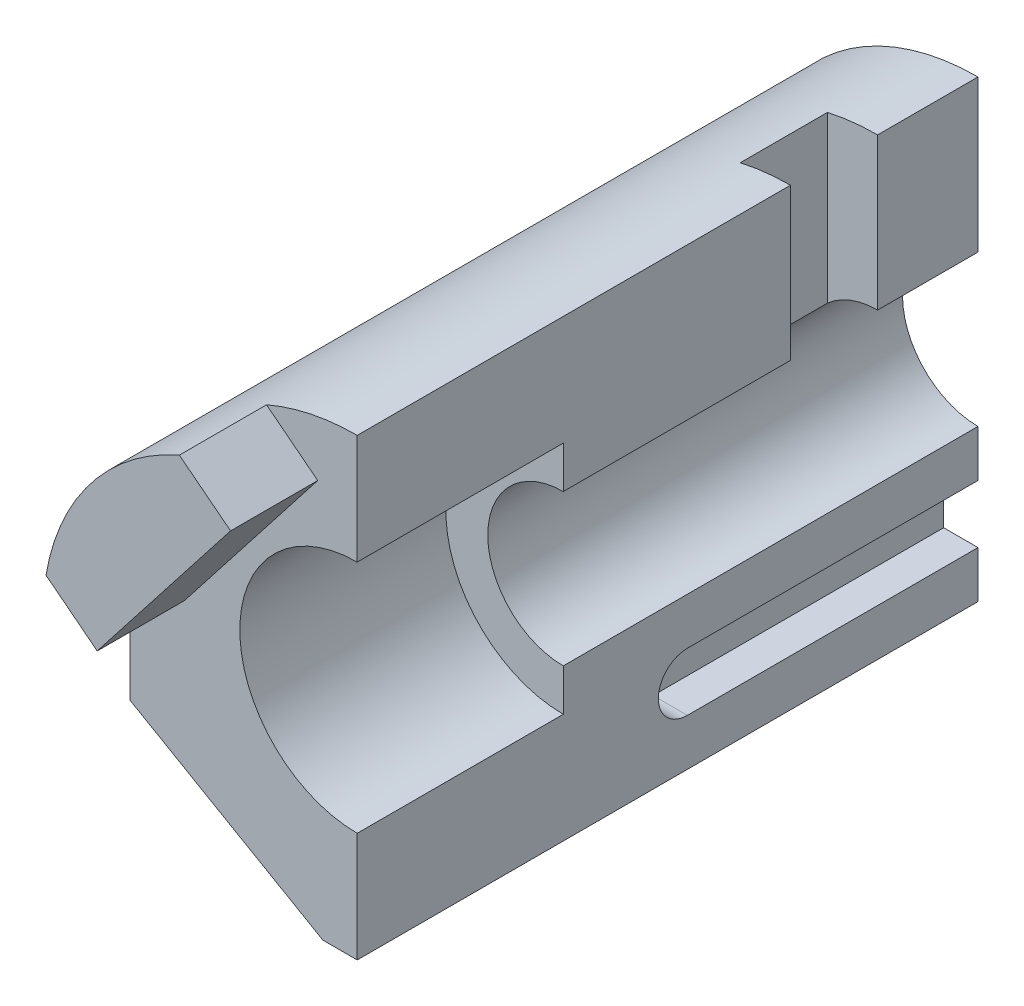
ISO-10303-21;
HEADER;
FILE_DESCRIPTION(('STEP AP214'),'2;1');
FILE_NAME('part.step','',(''),(''),'','','');
FILE_SCHEMA(('AUTOMOTIVE_DESIGN { 1 0 10303 214 1 1 1 1 }'));
ENDSEC;
DATA;
#1=APPLICATION_CONTEXT('core data for automotive mechanical design processes');
#2=APPLICATION_PROTOCOL_DEFINITION('international standard','automotive_design',2000,#1);
#3=PRODUCT_CONTEXT('',#1,'mechanical');
#4=PRODUCT('Part','Part','',(#3));
#5=PRODUCT_RELATED_PRODUCT_CATEGORY('part','',(#4));
#6=PRODUCT_DEFINITION_FORMATION('','',#4);
#7=PRODUCT_DEFINITION_CONTEXT('part definition',#1,'design');
#8=PRODUCT_DEFINITION('design','',#6,#7);
#9=PRODUCT_DEFINITION_SHAPE('','',#8);
#10=(LENGTH_UNIT() NAMED_UNIT(*) SI_UNIT(.MILLI.,.METRE.));
#11=(NAMED_UNIT(*) PLANE_ANGLE_UNIT() SI_UNIT($,.RADIAN.));
#12=(NAMED_UNIT(*) SI_UNIT($,.STERADIAN.) SOLID_ANGLE_UNIT());
#13=UNCERTAINTY_MEASURE_WITH_UNIT(LENGTH_MEASURE(1.E-05),#10,'distance_accuracy_value','');
#14=(GEOMETRIC_REPRESENTATION_CONTEXT(3) GLOBAL_UNCERTAINTY_ASSIGNED_CONTEXT((#13)) GLOBAL_UNIT_ASSIGNED_CONTEXT((#10,
#11,#12)) REPRESENTATION_CONTEXT('',''));
#15=CARTESIAN_POINT('',(0.,0.,0.));
#16=DIRECTION('',(0.,0.,1.));
#17=DIRECTION('',(1.,0.,0.));
#18=AXIS2_PLACEMENT_3D('',#15,#16,#17);
#19=CARTESIAN_POINT('',(0.,172.,235.));
#20=DIRECTION('',(-1.,0.,0.));
#21=DIRECTION('',(0.,-1.,0.));
#22=AXIS2_PLACEMENT_3D('',#19,#20,#21);
#23=PLANE('',#22);
#24=DIRECTION('',(0.,1.,0.));
#25=VECTOR('',#24,1.);
#26=CARTESIAN_POINT('',(0.,172.,38.));
#27=LINE('',#26,#25);
#28=CARTESIAN_POINT('',(0.,114.575,38.));
#29=VERTEX_POINT('',#28);
#30=CARTESIAN_POINT('',(0.,172.,38.));
#31=VERTEX_POINT('',#30);
#32=EDGE_CURVE('E198',#29,#31,#27,.T.);
#33=ORIENTED_EDGE('',*,*,#32,.F.);
#34=DIRECTION('',(0.,0.,1.));
#35=VECTOR('',#34,1.);
#36=CARTESIAN_POINT('',(0.,114.575,-33.0000000000001));
#37=LINE('',#36,#35);
#38=CARTESIAN_POINT('',(0.,114.575,0.));
#39=VERTEX_POINT('',#38);
#40=EDGE_CURVE('E293',#29,#39,#37,.F.);
#41=ORIENTED_EDGE('',*,*,#40,.T.);
#42=DIRECTION('',(0.,1.,0.));
#43=VECTOR('',#42,1.);
#44=CARTESIAN_POINT('',(0.,172.,0.));
#45=LINE('',#44,#43);
#46=CARTESIAN_POINT('',(0.,172.,0.));
#47=VERTEX_POINT('',#46);
#48=EDGE_CURVE('E316',#39,#47,#45,.T.);
#49=ORIENTED_EDGE('',*,*,#48,.T.);
#50=DIRECTION('',(0.,0.,-1.));
#51=VECTOR('',#50,1.);
#52=CARTESIAN_POINT('',(0.,172.,235.));
#53=LINE('',#52,#51);
#54=EDGE_CURVE('E369',#31,#47,#53,.T.);
#55=ORIENTED_EDGE('',*,*,#54,.F.);
#56=EDGE_LOOP('',(#33,#41,#49,#55));
#57=FACE_BOUND('',#56,.T.);
#58=ADVANCED_FACE('F45',(#57),#23,.F.);
#59=CARTESIAN_POINT('',(0.,0.,0.));
#60=VERTEX_POINT('',#59);
#61=CARTESIAN_POINT('',(0.,17.7125,0.));
#62=VERTEX_POINT('',#61);
#63=EDGE_CURVE('E337',#60,#62,#45,.T.);
#64=ORIENTED_EDGE('',*,*,#63,.T.);
#65=DIRECTION('',(0.,0.,-1.));
#66=VECTOR('',#65,1.);
#67=CARTESIAN_POINT('',(0.,17.7125,0.));
#68=LINE('',#67,#66);
#69=CARTESIAN_POINT('',(0.,17.7125,110.));
#70=VERTEX_POINT('',#69);
#71=EDGE_CURVE('E257',#70,#62,#68,.T.);
#72=ORIENTED_EDGE('',*,*,#71,.F.);
#73=CARTESIAN_POINT('',(0.,28.7125,110.));
#74=DIRECTION('',(1.,0.,0.));
#75=DIRECTION('',(0.,1.,0.));
#76=AXIS2_PLACEMENT_3D('',#73,#74,#75);
#77=CIRCLE('',#76,11.);
#78=CARTESIAN_POINT('',(0.,39.7125,110.));
#79=VERTEX_POINT('',#78);
#80=EDGE_CURVE('E268',#79,#70,#77,.T.);
#81=ORIENTED_EDGE('',*,*,#80,.F.);
#82=DIRECTION('',(0.,0.,1.));
#83=VECTOR('',#82,1.);
#84=CARTESIAN_POINT('',(0.,39.7125,0.));
#85=LINE('',#84,#83);
#86=CARTESIAN_POINT('',(0.,39.7125,0.));
#87=VERTEX_POINT('',#86);
#88=EDGE_CURVE('E251',#87,#79,#85,.T.);
#89=ORIENTED_EDGE('',*,*,#88,.F.);
#90=CARTESIAN_POINT('',(0.,57.425,0.));
#91=VERTEX_POINT('',#90);
#92=EDGE_CURVE('E342',#87,#91,#45,.T.);
#93=ORIENTED_EDGE('',*,*,#92,.T.);
#94=DIRECTION('',(0.,0.,1.));
#95=VECTOR('',#94,1.);
#96=CARTESIAN_POINT('',(0.,57.425,-33.0000000000001));
#97=LINE('',#96,#95);
#98=CARTESIAN_POINT('',(0.,57.425,157.));
#99=VERTEX_POINT('',#98);
#100=EDGE_CURVE('E297',#91,#99,#97,.T.);
#101=ORIENTED_EDGE('',*,*,#100,.T.);
#102=DIRECTION('',(0.,1.,0.));
#103=VECTOR('',#102,1.);
#104=CARTESIAN_POINT('',(0.,172.,157.));
#105=LINE('',#104,#103);
#106=CARTESIAN_POINT('',(0.,41.55,157.));
#107=VERTEX_POINT('',#106);
#108=EDGE_CURVE('E375',#107,#99,#105,.T.);
#109=ORIENTED_EDGE('',*,*,#108,.F.);
#110=DIRECTION('',(0.,0.,1.));
#111=VECTOR('',#110,1.);
#112=CARTESIAN_POINT('',(0.,41.55,157.));
#113=LINE('',#112,#111);
#114=CARTESIAN_POINT('',(0.,41.55,235.));
#115=VERTEX_POINT('',#114);
#116=EDGE_CURVE('E312',#107,#115,#113,.T.);
#117=ORIENTED_EDGE('',*,*,#116,.T.);
#118=DIRECTION('',(0.,1.,0.));
#119=VECTOR('',#118,1.);
#120=CARTESIAN_POINT('',(0.,172.,235.));
#121=LINE('',#120,#119);
#122=CARTESIAN_POINT('',(0.,0.,235.));
#123=VERTEX_POINT('',#122);
#124=EDGE_CURVE('E317',#123,#115,#121,.T.);
#125=ORIENTED_EDGE('',*,*,#124,.F.);
#126=DIRECTION('',(0.,0.,-1.));
#127=VECTOR('',#126,1.);
#128=CARTESIAN_POINT('',(0.,0.,235.));
#129=LINE('',#128,#127);
#130=EDGE_CURVE('E336',#123,#60,#129,.T.);
#131=ORIENTED_EDGE('',*,*,#130,.T.);
#132=EDGE_LOOP('',(#64,#72,#81,#89,#93,#101,#109,#117,#125,#131));
#133=FACE_BOUND('',#132,.T.);
#134=ADVANCED_FACE('F453',(#133),#23,.F.);
#135=CARTESIAN_POINT('',(0.,114.575,157.));
#136=VERTEX_POINT('',#135);
#137=CARTESIAN_POINT('',(0.,114.575,71.));
#138=VERTEX_POINT('',#137);
#139=EDGE_CURVE('E294',#136,#138,#37,.F.);
#140=ORIENTED_EDGE('',*,*,#139,.T.);
#141=DIRECTION('',(0.,-1.,0.));
#142=VECTOR('',#141,1.);
#143=CARTESIAN_POINT('',(0.,172.,71.));
#144=LINE('',#143,#142);
#145=CARTESIAN_POINT('',(0.,172.,71.));
#146=VERTEX_POINT('',#145);
#147=EDGE_CURVE('E204',#146,#138,#144,.T.);
#148=ORIENTED_EDGE('',*,*,#147,.F.);
#149=CARTESIAN_POINT('',(0.,172.,235.));
#150=VERTEX_POINT('',#149);
#151=EDGE_CURVE('E370',#150,#146,#53,.T.);
#152=ORIENTED_EDGE('',*,*,#151,.F.);
#153=CARTESIAN_POINT('',(0.,130.45,235.));
#154=VERTEX_POINT('',#153);
#155=EDGE_CURVE('E322',#154,#150,#121,.T.);
#156=ORIENTED_EDGE('',*,*,#155,.F.);
#157=DIRECTION('',(0.,0.,1.));
#158=VECTOR('',#157,1.);
#159=CARTESIAN_POINT('',(0.,130.45,157.));
#160=LINE('',#159,#158);
#161=CARTESIAN_POINT('',(0.,130.45,157.));
#162=VERTEX_POINT('',#161);
#163=EDGE_CURVE('E306',#154,#162,#160,.F.);
#164=ORIENTED_EDGE('',*,*,#163,.T.);
#165=EDGE_CURVE('E374',#136,#162,#105,.T.);
#166=ORIENTED_EDGE('',*,*,#165,.F.);
#167=EDGE_LOOP('',(#140,#148,#152,#156,#164,#166));
#168=FACE_BOUND('',#167,.T.);
#169=ADVANCED_FACE('F47',(#168),#23,.F.);
#170=CARTESIAN_POINT('',(-5.01709784828108E-09,86.,235.));
#171=DIRECTION('',(0.,0.,-1.));
#172=DIRECTION('',(-1.,0.,0.));
#173=AXIS2_PLACEMENT_3D('',#170,#171,#172);
#174=CYLINDRICAL_SURFACE('',#173,86.);
#175=ORIENTED_EDGE('',*,*,#151,.T.);
#176=CARTESIAN_POINT('',(-5.01709784828108E-09,86.,71.));
#177=DIRECTION('',(0.,0.,1.));
#178=DIRECTION('',(1.,0.,0.));
#179=AXIS2_PLACEMENT_3D('',#176,#177,#178);
#180=CIRCLE('',#179,86.);
#181=CARTESIAN_POINT('',(-19.,169.874906856524,71.));
#182=VERTEX_POINT('',#181);
#183=EDGE_CURVE('E11',#146,#182,#180,.T.);
#184=ORIENTED_EDGE('',*,*,#183,.T.);
#185=DIRECTION('',(0.,0.,-1.));
#186=VECTOR('',#185,1.);
#187=CARTESIAN_POINT('',(-19.,169.874906856524,235.));
#188=LINE('',#187,#186);
#189=CARTESIAN_POINT('',(-19.,169.874906856524,38.));
#190=VERTEX_POINT('',#189);
#191=EDGE_CURVE('E195',#190,#182,#188,.F.);
#192=ORIENTED_EDGE('',*,*,#191,.F.);
#193=CARTESIAN_POINT('',(-5.01709784828108E-09,86.,38.));
#194=DIRECTION('',(0.,0.,-1.));
#195=DIRECTION('',(0.,1.,0.));
#196=AXIS2_PLACEMENT_3D('',#193,#194,#195);
#197=CIRCLE('',#196,86.);
#198=EDGE_CURVE('E54',#190,#31,#197,.T.);
#199=ORIENTED_EDGE('',*,*,#198,.T.);
#200=ORIENTED_EDGE('',*,*,#54,.T.);
#201=CARTESIAN_POINT('',(-5.01709784828108E-09,86.,0.));
#202=DIRECTION('',(0.,0.,1.));
#203=DIRECTION('',(-1.,0.,0.));
#204=AXIS2_PLACEMENT_3D('',#201,#202,#203);
#205=CIRCLE('',#204,86.);
#206=CARTESIAN_POINT('',(-86.,85.9990710556561,0.));
#207=VERTEX_POINT('',#206);
#208=EDGE_CURVE('E341',#47,#207,#205,.T.);
#209=ORIENTED_EDGE('',*,*,#208,.T.);
#210=DIRECTION('',(0.,0.,-1.));
#211=VECTOR('',#210,1.);
#212=CARTESIAN_POINT('',(-86.,85.9990710556561,235.));
#213=LINE('',#212,#211);
#214=CARTESIAN_POINT('',(-86.,85.9990710556561,235.));
#215=VERTEX_POINT('',#214);
#216=EDGE_CURVE('E365',#215,#207,#213,.T.);
#217=ORIENTED_EDGE('',*,*,#216,.F.);
#218=CARTESIAN_POINT('',(-5.01709784828108E-09,86.,235.));
#219=DIRECTION('',(0.,0.,1.));
#220=DIRECTION('',(-1.,0.,0.));
#221=AXIS2_PLACEMENT_3D('',#218,#219,#220);
#222=CIRCLE('',#221,86.);
#223=CARTESIAN_POINT('',(-84.8138572204116,100.234100753004,235.));
#224=VERTEX_POINT('',#223);
#225=EDGE_CURVE('E321',#224,#215,#222,.T.);
#226=ORIENTED_EDGE('',*,*,#225,.F.);
#227=DIRECTION('',(0.,0.,-1.));
#228=VECTOR('',#227,1.);
#229=CARTESIAN_POINT('',(-84.8138572204116,100.234100753004,268.));
#230=LINE('',#229,#228);
#231=CARTESIAN_POINT('',(-84.8138572204116,100.234100753004,268.));
#232=VERTEX_POINT('',#231);
#233=EDGE_CURVE('E248',#232,#224,#230,.T.);
#234=ORIENTED_EDGE('',*,*,#233,.F.);
#235=CARTESIAN_POINT('',(-5.01709784828108E-09,86.,268.));
#236=DIRECTION('',(0.,0.,1.));
#237=DIRECTION('',(1.,0.,0.));
#238=AXIS2_PLACEMENT_3D('',#235,#236,#237);
#239=CIRCLE('',#238,86.);
#240=CARTESIAN_POINT('',(-34.329616243708,164.850982548756,268.));
#241=VERTEX_POINT('',#240);
#242=EDGE_CURVE('E220',#241,#232,#239,.T.);
#243=ORIENTED_EDGE('',*,*,#242,.F.);
#244=DIRECTION('',(0.,0.,-1.));
#245=VECTOR('',#244,1.);
#246=CARTESIAN_POINT('',(-34.329616243708,164.850982548756,268.));
#247=LINE('',#246,#245);
#248=CARTESIAN_POINT('',(-34.329616243708,164.850982548756,235.));
#249=VERTEX_POINT('',#248);
#250=EDGE_CURVE('E238',#241,#249,#247,.T.);
#251=ORIENTED_EDGE('',*,*,#250,.T.);
#252=EDGE_CURVE('E323',#150,#249,#222,.T.);
#253=ORIENTED_EDGE('',*,*,#252,.F.);
#254=EDGE_LOOP('',(#175,#184,#192,#199,#200,#209,#217,#226,#234,#243,#251,#253));
#255=FACE_BOUND('',#254,.T.);
#256=ADVANCED_FACE('F400',(#255),#174,.T.);
#257=CARTESIAN_POINT('',(-86.,42.1465696508428,235.));
#258=DIRECTION('',(1.,0.,0.));
#259=DIRECTION('',(0.,0.,-1.));
#260=AXIS2_PLACEMENT_3D('',#257,#258,#259);
#261=PLANE('',#260);
#262=DIRECTION('',(0.,-1.,0.));
#263=VECTOR('',#262,1.);
#264=CARTESIAN_POINT('',(-86.,42.1465696508428,0.));
#265=LINE('',#264,#263);
#266=CARTESIAN_POINT('',(-86.,42.1465696508428,0.));
#267=VERTEX_POINT('',#266);
#268=EDGE_CURVE('E345',#207,#267,#265,.T.);
#269=ORIENTED_EDGE('',*,*,#268,.T.);
#270=DIRECTION('',(0.,0.,-1.));
#271=VECTOR('',#270,1.);
#272=CARTESIAN_POINT('',(-86.,42.1465696508428,235.));
#273=LINE('',#272,#271);
#274=CARTESIAN_POINT('',(-86.,42.1465696508428,235.));
#275=VERTEX_POINT('',#274);
#276=EDGE_CURVE('E361',#275,#267,#273,.T.);
#277=ORIENTED_EDGE('',*,*,#276,.F.);
#278=DIRECTION('',(0.,-1.,0.));
#279=VECTOR('',#278,1.);
#280=CARTESIAN_POINT('',(-86.,42.1465696508428,235.));
#281=LINE('',#280,#279);
#282=EDGE_CURVE('E327',#215,#275,#281,.T.);
#283=ORIENTED_EDGE('',*,*,#282,.F.);
#284=ORIENTED_EDGE('',*,*,#216,.T.);
#285=EDGE_LOOP('',(#269,#277,#283,#284));
#286=FACE_BOUND('',#285,.T.);
#287=ADVANCED_FACE('F424',(#286),#261,.F.);
#288=CARTESIAN_POINT('',(-13.,0.,235.));
#289=DIRECTION('',(0.500000000000001,0.866025403784438,0.));
#290=DIRECTION('',(-0.866025403784438,0.500000000000001,0.));
#291=AXIS2_PLACEMENT_3D('',#288,#289,#290);
#292=PLANE('',#291);
#293=DIRECTION('',(0.866025403784438,-0.500000000000001,0.));
#294=VECTOR('',#293,1.);
#295=CARTESIAN_POINT('',(-13.,0.,0.));
#296=LINE('',#295,#294);
#297=CARTESIAN_POINT('',(-13.,0.,0.));
#298=VERTEX_POINT('',#297);
#299=EDGE_CURVE('E348',#267,#298,#296,.T.);
#300=ORIENTED_EDGE('',*,*,#299,.T.);
#301=DIRECTION('',(0.,0.,-1.));
#302=VECTOR('',#301,1.);
#303=CARTESIAN_POINT('',(-13.,0.,235.));
#304=LINE('',#303,#302);
#305=CARTESIAN_POINT('',(-13.,0.,235.));
#306=VERTEX_POINT('',#305);
#307=EDGE_CURVE('E357',#306,#298,#304,.T.);
#308=ORIENTED_EDGE('',*,*,#307,.F.);
#309=DIRECTION('',(0.866025403784438,-0.500000000000001,0.));
#310=VECTOR('',#309,1.);
#311=CARTESIAN_POINT('',(-13.,0.,235.));
#312=LINE('',#311,#310);
#313=EDGE_CURVE('E330',#275,#306,#312,.T.);
#314=ORIENTED_EDGE('',*,*,#313,.F.);
#315=ORIENTED_EDGE('',*,*,#276,.T.);
#316=EDGE_LOOP('',(#300,#308,#314,#315));
#317=FACE_BOUND('',#316,.T.);
#318=ADVANCED_FACE('F476',(#317),#292,.F.);
#319=CARTESIAN_POINT('',(0.,0.,235.));
#320=DIRECTION('',(0.,1.,0.));
#321=DIRECTION('',(-1.,0.,0.));
#322=AXIS2_PLACEMENT_3D('',#319,#320,#321);
#323=PLANE('',#322);
#324=DIRECTION('',(1.,0.,0.));
#325=VECTOR('',#324,1.);
#326=CARTESIAN_POINT('',(0.,0.,0.));
#327=LINE('',#326,#325);
#328=EDGE_CURVE('E351',#298,#60,#327,.T.);
#329=ORIENTED_EDGE('',*,*,#328,.T.);
#330=ORIENTED_EDGE('',*,*,#130,.F.);
#331=DIRECTION('',(1.,0.,0.));
#332=VECTOR('',#331,1.);
#333=CARTESIAN_POINT('',(0.,0.,235.));
#334=LINE('',#333,#332);
#335=EDGE_CURVE('E333',#306,#123,#334,.T.);
#336=ORIENTED_EDGE('',*,*,#335,.F.);
#337=ORIENTED_EDGE('',*,*,#307,.T.);
#338=EDGE_LOOP('',(#329,#330,#336,#337));
#339=FACE_BOUND('',#338,.T.);
#340=ADVANCED_FACE('F474',(#339),#323,.F.);
#341=CARTESIAN_POINT('',(-5.01709784828108E-09,86.,235.));
#342=DIRECTION('',(0.,0.,-1.));
#343=DIRECTION('',(-1.,0.,0.));
#344=AXIS2_PLACEMENT_3D('',#341,#342,#343);
#345=PLANE('',#344);
#346=DIRECTION('',(-0.615661475325653,-0.788010753606726,0.));
#347=VECTOR('',#346,1.);
#348=CARTESIAN_POINT('',(-40.1885484389601,117.398735241608,235.));
#349=LINE('',#348,#347);
#350=CARTESIAN_POINT('',(-14.9464279506083,149.707176139484,235.));
#351=VERTEX_POINT('',#350);
#352=CARTESIAN_POINT('',(-65.4306689273119,85.0902943437325,235.));
#353=VERTEX_POINT('',#352);
#354=EDGE_CURVE('E387',#351,#353,#349,.T.);
#355=ORIENTED_EDGE('',*,*,#354,.T.);
#356=DIRECTION('',(-0.788010753606726,0.615661475325653,0.));
#357=VECTOR('',#356,1.);
#358=CARTESIAN_POINT('',(-25.2421204933689,53.6915591021242,235.));
#359=LINE('',#358,#357);
#360=EDGE_CURVE('E391',#353,#224,#359,.T.);
#361=ORIENTED_EDGE('',*,*,#360,.T.);
#362=ORIENTED_EDGE('',*,*,#225,.T.);
#363=ORIENTED_EDGE('',*,*,#282,.T.);
#364=ORIENTED_EDGE('',*,*,#313,.T.);
#365=ORIENTED_EDGE('',*,*,#335,.T.);
#366=ORIENTED_EDGE('',*,*,#124,.T.);
#367=CARTESIAN_POINT('',(0.,86.,235.));
#368=DIRECTION('',(0.,0.,1.));
#369=DIRECTION('',(1.,0.,0.));
#370=AXIS2_PLACEMENT_3D('',#367,#368,#369);
#371=CIRCLE('',#370,44.45);
#372=EDGE_CURVE('E301',#154,#115,#371,.T.);
#373=ORIENTED_EDGE('',*,*,#372,.F.);
#374=ORIENTED_EDGE('',*,*,#155,.T.);
#375=ORIENTED_EDGE('',*,*,#252,.T.);
#376=DIRECTION('',(0.788010753606726,-0.615661475325654,0.));
#377=VECTOR('',#376,1.);
#378=CARTESIAN_POINT('',(25.2421204833347,118.308440897876,235.));
#379=LINE('',#378,#377);
#380=EDGE_CURVE('E383',#249,#351,#379,.T.);
#381=ORIENTED_EDGE('',*,*,#380,.T.);
#382=EDGE_LOOP('',(#355,#361,#362,#363,#364,#365,#366,#373,#374,#375,#381));
#383=FACE_BOUND('',#382,.T.);
#384=ADVANCED_FACE('F428',(#383),#345,.F.);
#385=CARTESIAN_POINT('',(-5.01709784828108E-09,86.,0.));
#386=DIRECTION('',(0.,0.,-1.));
#387=DIRECTION('',(-1.,0.,0.));
#388=AXIS2_PLACEMENT_3D('',#385,#386,#387);
#389=PLANE('',#388);
#390=DIRECTION('',(1.,0.,0.));
#391=VECTOR('',#390,1.);
#392=CARTESIAN_POINT('',(-13.,17.7125,0.));
#393=LINE('',#392,#391);
#394=CARTESIAN_POINT('',(-13.,17.7125,0.));
#395=VERTEX_POINT('',#394);
#396=EDGE_CURVE('E274',#395,#62,#393,.T.);
#397=ORIENTED_EDGE('',*,*,#396,.T.);
#398=ORIENTED_EDGE('',*,*,#63,.F.);
#399=ORIENTED_EDGE('',*,*,#328,.F.);
#400=ORIENTED_EDGE('',*,*,#299,.F.);
#401=ORIENTED_EDGE('',*,*,#268,.F.);
#402=ORIENTED_EDGE('',*,*,#208,.F.);
#403=ORIENTED_EDGE('',*,*,#48,.F.);
#404=CARTESIAN_POINT('',(0.,86.,0.));
#405=DIRECTION('',(0.,0.,-1.));
#406=DIRECTION('',(-1.,0.,0.));
#407=AXIS2_PLACEMENT_3D('',#404,#405,#406);
#408=CIRCLE('',#407,28.575);
#409=EDGE_CURVE('E289',#91,#39,#408,.T.);
#410=ORIENTED_EDGE('',*,*,#409,.F.);
#411=ORIENTED_EDGE('',*,*,#92,.F.);
#412=DIRECTION('',(1.,0.,0.));
#413=VECTOR('',#412,1.);
#414=CARTESIAN_POINT('',(-13.,39.7125,0.));
#415=LINE('',#414,#413);
#416=CARTESIAN_POINT('',(-13.,39.7125,0.));
#417=VERTEX_POINT('',#416);
#418=EDGE_CURVE('E264',#417,#87,#415,.T.);
#419=ORIENTED_EDGE('',*,*,#418,.F.);
#420=DIRECTION('',(0.,-1.,0.));
#421=VECTOR('',#420,1.);
#422=CARTESIAN_POINT('',(-13.,86.,0.));
#423=LINE('',#422,#421);
#424=EDGE_CURVE('E379',#417,#395,#423,.T.);
#425=ORIENTED_EDGE('',*,*,#424,.T.);
#426=EDGE_LOOP('',(#397,#398,#399,#400,#401,#402,#403,#410,#411,#419,#425));
#427=FACE_BOUND('',#426,.T.);
#428=ADVANCED_FACE('F417',(#427),#389,.T.);
#429=CARTESIAN_POINT('',(0.,86.,157.));
#430=DIRECTION('',(0.,0.,1.));
#431=DIRECTION('',(1.,0.,0.));
#432=AXIS2_PLACEMENT_3D('',#429,#430,#431);
#433=PLANE('',#432);
#434=CARTESIAN_POINT('',(0.,86.,157.));
#435=DIRECTION('',(0.,0.,1.));
#436=DIRECTION('',(1.,0.,0.));
#437=AXIS2_PLACEMENT_3D('',#434,#435,#436);
#438=CIRCLE('',#437,28.575);
#439=EDGE_CURVE('E278',#136,#99,#438,.T.);
#440=ORIENTED_EDGE('',*,*,#439,.F.);
#441=ORIENTED_EDGE('',*,*,#165,.T.);
#442=CARTESIAN_POINT('',(0.,86.,157.));
#443=DIRECTION('',(0.,0.,1.));
#444=DIRECTION('',(1.,0.,0.));
#445=AXIS2_PLACEMENT_3D('',#442,#443,#444);
#446=CIRCLE('',#445,44.45);
#447=EDGE_CURVE('E302',#162,#107,#446,.T.);
#448=ORIENTED_EDGE('',*,*,#447,.T.);
#449=ORIENTED_EDGE('',*,*,#108,.T.);
#450=EDGE_LOOP('',(#440,#441,#448,#449));
#451=FACE_BOUND('',#450,.T.);
#452=ADVANCED_FACE('F449',(#451),#433,.T.);
#453=CARTESIAN_POINT('',(0.,86.,157.));
#454=DIRECTION('',(0.,0.,1.));
#455=DIRECTION('',(1.,0.,0.));
#456=AXIS2_PLACEMENT_3D('',#453,#454,#455);
#457=CYLINDRICAL_SURFACE('',#456,44.45);
#458=ORIENTED_EDGE('',*,*,#447,.F.);
#459=ORIENTED_EDGE('',*,*,#163,.F.);
#460=ORIENTED_EDGE('',*,*,#372,.T.);
#461=ORIENTED_EDGE('',*,*,#116,.F.);
#462=EDGE_LOOP('',(#458,#459,#460,#461));
#463=FACE_BOUND('',#462,.T.);
#464=ADVANCED_FACE('F584',(#463),#457,.F.);
#465=CARTESIAN_POINT('',(0.,86.,-33.0000000000001));
#466=DIRECTION('',(0.,0.,1.));
#467=DIRECTION('',(1.,0.,0.));
#468=AXIS2_PLACEMENT_3D('',#465,#466,#467);
#469=CYLINDRICAL_SURFACE('',#468,28.575);
#470=ORIENTED_EDGE('',*,*,#40,.F.);
#471=CARTESIAN_POINT('',(0.,86.,38.));
#472=DIRECTION('',(0.,0.,-1.));
#473=DIRECTION('',(-1.,0.,0.));
#474=AXIS2_PLACEMENT_3D('',#471,#472,#473);
#475=CIRCLE('',#474,28.575);
#476=CARTESIAN_POINT('',(-19.,107.343163425322,38.));
#477=VERTEX_POINT('',#476);
#478=EDGE_CURVE('E208',#477,#29,#475,.T.);
#479=ORIENTED_EDGE('',*,*,#478,.F.);
#480=DIRECTION('',(0.,0.,1.));
#481=VECTOR('',#480,1.);
#482=CARTESIAN_POINT('',(-19.,107.343163425322,-33.0000000000001));
#483=LINE('',#482,#481);
#484=CARTESIAN_POINT('',(-19.,107.343163425322,71.));
#485=VERTEX_POINT('',#484);
#486=EDGE_CURVE('E192',#485,#477,#483,.F.);
#487=ORIENTED_EDGE('',*,*,#486,.F.);
#488=CARTESIAN_POINT('',(0.,86.,71.));
#489=DIRECTION('',(0.,0.,1.));
#490=DIRECTION('',(1.,0.,0.));
#491=AXIS2_PLACEMENT_3D('',#488,#489,#490);
#492=CIRCLE('',#491,28.575);
#493=EDGE_CURVE('E201',#138,#485,#492,.T.);
#494=ORIENTED_EDGE('',*,*,#493,.F.);
#495=ORIENTED_EDGE('',*,*,#139,.F.);
#496=ORIENTED_EDGE('',*,*,#439,.T.);
#497=ORIENTED_EDGE('',*,*,#100,.F.);
#498=ORIENTED_EDGE('',*,*,#409,.T.);
#499=EDGE_LOOP('',(#470,#479,#487,#494,#495,#496,#497,#498));
#500=FACE_BOUND('',#499,.T.);
#501=ADVANCED_FACE('F211',(#500),#469,.F.);
#502=CARTESIAN_POINT('',(-13.,17.7125,0.));
#503=DIRECTION('',(0.,-1.,0.));
#504=DIRECTION('',(1.,0.,0.));
#505=AXIS2_PLACEMENT_3D('',#502,#503,#504);
#506=PLANE('',#505);
#507=ORIENTED_EDGE('',*,*,#71,.T.);
#508=ORIENTED_EDGE('',*,*,#396,.F.);
#509=DIRECTION('',(0.,0.,-1.));
#510=VECTOR('',#509,1.);
#511=CARTESIAN_POINT('',(-13.,17.7125,0.));
#512=LINE('',#511,#510);
#513=CARTESIAN_POINT('',(-13.,17.7125,110.));
#514=VERTEX_POINT('',#513);
#515=EDGE_CURVE('E261',#514,#395,#512,.T.);
#516=ORIENTED_EDGE('',*,*,#515,.F.);
#517=DIRECTION('',(1.,0.,0.));
#518=VECTOR('',#517,1.);
#519=CARTESIAN_POINT('',(-13.,17.7125,110.));
#520=LINE('',#519,#518);
#521=EDGE_CURVE('E279',#514,#70,#520,.T.);
#522=ORIENTED_EDGE('',*,*,#521,.T.);
#523=EDGE_LOOP('',(#507,#508,#516,#522));
#524=FACE_BOUND('',#523,.T.);
#525=ADVANCED_FACE('F467',(#524),#506,.F.);
#526=CARTESIAN_POINT('',(-13.,28.7125,110.));
#527=DIRECTION('',(1.,0.,0.));
#528=DIRECTION('',(0.,1.,0.));
#529=AXIS2_PLACEMENT_3D('',#526,#527,#528);
#530=CYLINDRICAL_SURFACE('',#529,11.);
#531=ORIENTED_EDGE('',*,*,#80,.T.);
#532=ORIENTED_EDGE('',*,*,#521,.F.);
#533=CARTESIAN_POINT('',(-13.,28.7125,110.));
#534=DIRECTION('',(1.,0.,0.));
#535=DIRECTION('',(0.,1.,0.));
#536=AXIS2_PLACEMENT_3D('',#533,#534,#535);
#537=CIRCLE('',#536,11.);
#538=CARTESIAN_POINT('',(-13.,39.7125,110.));
#539=VERTEX_POINT('',#538);
#540=EDGE_CURVE('E256',#539,#514,#537,.T.);
#541=ORIENTED_EDGE('',*,*,#540,.F.);
#542=DIRECTION('',(1.,0.,0.));
#543=VECTOR('',#542,1.);
#544=CARTESIAN_POINT('',(-13.,39.7125,110.));
#545=LINE('',#544,#543);
#546=EDGE_CURVE('E282',#539,#79,#545,.T.);
#547=ORIENTED_EDGE('',*,*,#546,.T.);
#548=EDGE_LOOP('',(#531,#532,#541,#547));
#549=FACE_BOUND('',#548,.T.);
#550=ADVANCED_FACE('F548',(#549),#530,.F.);
#551=CARTESIAN_POINT('',(-13.,39.7125,0.));
#552=DIRECTION('',(0.,1.,0.));
#553=DIRECTION('',(0.,0.,1.));
#554=AXIS2_PLACEMENT_3D('',#551,#552,#553);
#555=PLANE('',#554);
#556=ORIENTED_EDGE('',*,*,#88,.T.);
#557=ORIENTED_EDGE('',*,*,#546,.F.);
#558=DIRECTION('',(0.,0.,1.));
#559=VECTOR('',#558,1.);
#560=CARTESIAN_POINT('',(-13.,39.7125,0.));
#561=LINE('',#560,#559);
#562=EDGE_CURVE('E252',#417,#539,#561,.T.);
#563=ORIENTED_EDGE('',*,*,#562,.F.);
#564=ORIENTED_EDGE('',*,*,#418,.T.);
#565=EDGE_LOOP('',(#556,#557,#563,#564));
#566=FACE_BOUND('',#565,.T.);
#567=ADVANCED_FACE('F460',(#566),#555,.F.);
#568=CARTESIAN_POINT('',(-13.,28.7125,0.));
#569=DIRECTION('',(1.,0.,0.));
#570=DIRECTION('',(0.,1.,0.));
#571=AXIS2_PLACEMENT_3D('',#568,#569,#570);
#572=PLANE('',#571);
#573=ORIENTED_EDGE('',*,*,#562,.T.);
#574=ORIENTED_EDGE('',*,*,#540,.T.);
#575=ORIENTED_EDGE('',*,*,#515,.T.);
#576=ORIENTED_EDGE('',*,*,#424,.F.);
#577=EDGE_LOOP('',(#573,#574,#575,#576));
#578=FACE_BOUND('',#577,.T.);
#579=ADVANCED_FACE('F463',(#578),#572,.T.);
#580=CARTESIAN_POINT('',(-65.4306689273119,85.0902943437325,268.));
#581=DIRECTION('',(-0.615661475325653,-0.788010753606726,0.));
#582=DIRECTION('',(0.788010753606726,-0.615661475325653,0.));
#583=AXIS2_PLACEMENT_3D('',#580,#581,#582);
#584=PLANE('',#583);
#585=ORIENTED_EDGE('',*,*,#360,.F.);
#586=DIRECTION('',(0.,0.,-1.));
#587=VECTOR('',#586,1.);
#588=CARTESIAN_POINT('',(-65.4306689273119,85.0902943437325,268.));
#589=LINE('',#588,#587);
#590=CARTESIAN_POINT('',(-65.4306689273119,85.0902943437325,268.));
#591=VERTEX_POINT('',#590);
#592=EDGE_CURVE('E244',#591,#353,#589,.T.);
#593=ORIENTED_EDGE('',*,*,#592,.F.);
#594=DIRECTION('',(-0.788010753606726,0.615661475325653,0.));
#595=VECTOR('',#594,1.);
#596=CARTESIAN_POINT('',(-65.4306689273119,85.0902943437325,268.));
#597=LINE('',#596,#595);
#598=EDGE_CURVE('E227',#591,#232,#597,.T.);
#599=ORIENTED_EDGE('',*,*,#598,.T.);
#600=ORIENTED_EDGE('',*,*,#233,.T.);
#601=EDGE_LOOP('',(#585,#593,#599,#600));
#602=FACE_BOUND('',#601,.T.);
#603=ADVANCED_FACE('F435',(#602),#584,.T.);
#604=CARTESIAN_POINT('',(-14.9464279506083,149.707176139484,268.));
#605=DIRECTION('',(0.788010753606726,-0.615661475325653,0.));
#606=DIRECTION('',(0.615661475325653,0.788010753606726,0.));
#607=AXIS2_PLACEMENT_3D('',#604,#605,#606);
#608=PLANE('',#607);
#609=ORIENTED_EDGE('',*,*,#354,.F.);
#610=DIRECTION('',(0.,0.,-1.));
#611=VECTOR('',#610,1.);
#612=CARTESIAN_POINT('',(-14.9464279506083,149.707176139484,268.));
#613=LINE('',#612,#611);
#614=CARTESIAN_POINT('',(-14.9464279506083,149.707176139484,268.));
#615=VERTEX_POINT('',#614);
#616=EDGE_CURVE('E69',#615,#351,#613,.T.);
#617=ORIENTED_EDGE('',*,*,#616,.F.);
#618=DIRECTION('',(-0.615661475325653,-0.788010753606726,0.));
#619=VECTOR('',#618,1.);
#620=CARTESIAN_POINT('',(-40.1885484389601,117.398735241608,268.));
#621=LINE('',#620,#619);
#622=EDGE_CURVE('E231',#615,#591,#621,.T.);
#623=ORIENTED_EDGE('',*,*,#622,.T.);
#624=ORIENTED_EDGE('',*,*,#592,.T.);
#625=EDGE_LOOP('',(#609,#617,#623,#624));
#626=FACE_BOUND('',#625,.T.);
#627=ADVANCED_FACE('F439',(#626),#608,.T.);
#628=CARTESIAN_POINT('',(-34.329616243708,164.850982548756,268.));
#629=DIRECTION('',(0.615661475325654,0.788010753606725,0.));
#630=DIRECTION('',(-0.788010753606726,0.615661475325654,0.));
#631=AXIS2_PLACEMENT_3D('',#628,#629,#630);
#632=PLANE('',#631);
#633=ORIENTED_EDGE('',*,*,#380,.F.);
#634=ORIENTED_EDGE('',*,*,#250,.F.);
#635=DIRECTION('',(0.788010753606726,-0.615661475325654,0.));
#636=VECTOR('',#635,1.);
#637=CARTESIAN_POINT('',(-34.329616243708,164.850982548756,268.));
#638=LINE('',#637,#636);
#639=EDGE_CURVE('E235',#241,#615,#638,.T.);
#640=ORIENTED_EDGE('',*,*,#639,.T.);
#641=ORIENTED_EDGE('',*,*,#616,.T.);
#642=EDGE_LOOP('',(#633,#634,#640,#641));
#643=FACE_BOUND('',#642,.T.);
#644=ADVANCED_FACE('F440',(#643),#632,.T.);
#645=CARTESIAN_POINT('',(-5.01709784828108E-09,86.,268.));
#646=DIRECTION('',(0.,0.,1.));
#647=DIRECTION('',(1.,0.,0.));
#648=AXIS2_PLACEMENT_3D('',#645,#646,#647);
#649=PLANE('',#648);
#650=ORIENTED_EDGE('',*,*,#242,.T.);
#651=ORIENTED_EDGE('',*,*,#598,.F.);
#652=ORIENTED_EDGE('',*,*,#622,.F.);
#653=ORIENTED_EDGE('',*,*,#639,.F.);
#654=EDGE_LOOP('',(#650,#651,#652,#653));
#655=FACE_BOUND('',#654,.T.);
#656=ADVANCED_FACE('F437',(#655),#649,.T.);
#657=CARTESIAN_POINT('',(-19.,172.,71.));
#658=DIRECTION('',(0.,0.,1.));
#659=DIRECTION('',(1.,0.,0.));
#660=AXIS2_PLACEMENT_3D('',#657,#658,#659);
#661=PLANE('',#660);
#662=ORIENTED_EDGE('',*,*,#147,.T.);
#663=ORIENTED_EDGE('',*,*,#493,.T.);
#664=DIRECTION('',(0.,-1.,0.));
#665=VECTOR('',#664,1.);
#666=CARTESIAN_POINT('',(-19.,172.,71.));
#667=LINE('',#666,#665);
#668=EDGE_CURVE('E188',#182,#485,#667,.T.);
#669=ORIENTED_EDGE('',*,*,#668,.F.);
#670=ORIENTED_EDGE('',*,*,#183,.F.);
#671=EDGE_LOOP('',(#662,#663,#669,#670));
#672=FACE_BOUND('',#671,.T.);
#673=ADVANCED_FACE('F202',(#672),#661,.F.);
#674=CARTESIAN_POINT('',(-19.,172.,38.));
#675=DIRECTION('',(0.,0.,-1.));
#676=DIRECTION('',(0.,1.,0.));
#677=AXIS2_PLACEMENT_3D('',#674,#675,#676);
#678=PLANE('',#677);
#679=DIRECTION('',(0.,1.,0.));
#680=VECTOR('',#679,1.);
#681=CARTESIAN_POINT('',(-19.,172.,38.));
#682=LINE('',#681,#680);
#683=EDGE_CURVE('E61',#477,#190,#682,.T.);
#684=ORIENTED_EDGE('',*,*,#683,.F.);
#685=ORIENTED_EDGE('',*,*,#478,.T.);
#686=ORIENTED_EDGE('',*,*,#32,.T.);
#687=ORIENTED_EDGE('',*,*,#198,.F.);
#688=EDGE_LOOP('',(#684,#685,#686,#687));
#689=FACE_BOUND('',#688,.T.);
#690=ADVANCED_FACE('F633',(#689),#678,.F.);
#691=CARTESIAN_POINT('',(-19.,0.,0.));
#692=DIRECTION('',(1.,0.,0.));
#693=DIRECTION('',(0.,1.,0.));
#694=AXIS2_PLACEMENT_3D('',#691,#692,#693);
#695=PLANE('',#694);
#696=ORIENTED_EDGE('',*,*,#191,.T.);
#697=ORIENTED_EDGE('',*,*,#668,.T.);
#698=ORIENTED_EDGE('',*,*,#486,.T.);
#699=ORIENTED_EDGE('',*,*,#683,.T.);
#700=EDGE_LOOP('',(#696,#697,#698,#699));
#701=FACE_BOUND('',#700,.T.);
#702=ADVANCED_FACE('F190',(#701),#695,.T.);
#703=CLOSED_SHELL('',(#58,#134,#169,#256,#287,#318,#340,#384,#428,#452,#464,#501,#525,#550,#567,
#579,#603,#627,#644,#656,#673,#690,#702));
#704=MANIFOLD_SOLID_BREP('B2',#703);
#705=ADVANCED_BREP_SHAPE_REPRESENTATION('',(#18,#704),#14);
#706=SHAPE_DEFINITION_REPRESENTATION(#9,#705);
ENDSEC;
END-ISO-10303-21;
